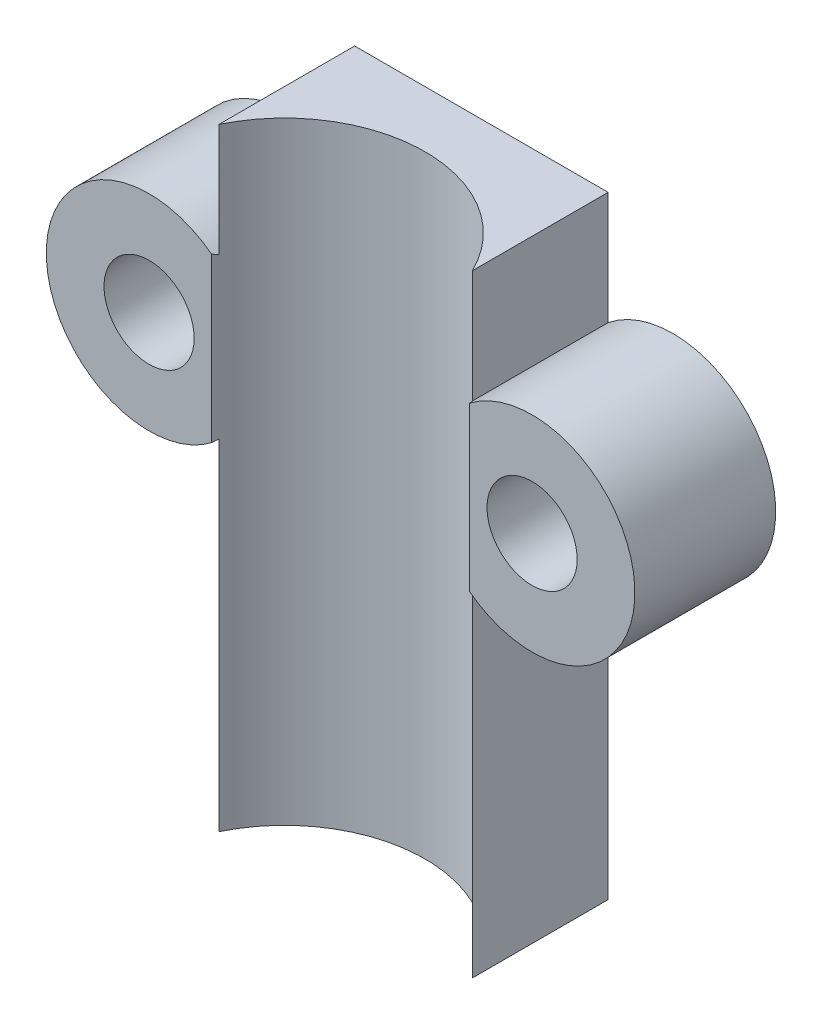
ISO-10303-21;
HEADER;
FILE_DESCRIPTION(('STEP AP214'),'2;1');
FILE_NAME('part.step','',(''),(''),'','','');
FILE_SCHEMA(('AUTOMOTIVE_DESIGN { 1 0 10303 214 1 1 1 1 }'));
ENDSEC;
DATA;
#1=APPLICATION_CONTEXT('core data for automotive mechanical design processes');
#2=APPLICATION_PROTOCOL_DEFINITION('international standard','automotive_design',2000,#1);
#3=PRODUCT_CONTEXT('',#1,'mechanical');
#4=PRODUCT('Part','Part','',(#3));
#5=PRODUCT_RELATED_PRODUCT_CATEGORY('part','',(#4));
#6=PRODUCT_DEFINITION_FORMATION('','',#4);
#7=PRODUCT_DEFINITION_CONTEXT('part definition',#1,'design');
#8=PRODUCT_DEFINITION('design','',#6,#7);
#9=PRODUCT_DEFINITION_SHAPE('','',#8);
#10=(LENGTH_UNIT() NAMED_UNIT(*) SI_UNIT(.MILLI.,.METRE.));
#11=(NAMED_UNIT(*) PLANE_ANGLE_UNIT() SI_UNIT($,.RADIAN.));
#12=(NAMED_UNIT(*) SI_UNIT($,.STERADIAN.) SOLID_ANGLE_UNIT());
#13=UNCERTAINTY_MEASURE_WITH_UNIT(LENGTH_MEASURE(1.E-05),#10,'distance_accuracy_value','');
#14=(GEOMETRIC_REPRESENTATION_CONTEXT(3) GLOBAL_UNCERTAINTY_ASSIGNED_CONTEXT((#13)) GLOBAL_UNIT_ASSIGNED_CONTEXT((#10,
#11,#12)) REPRESENTATION_CONTEXT('',''));
#15=CARTESIAN_POINT('',(0.,0.,0.));
#16=DIRECTION('',(0.,0.,1.));
#17=DIRECTION('',(1.,0.,0.));
#18=AXIS2_PLACEMENT_3D('',#15,#16,#17);
#19=CARTESIAN_POINT('',(-156.498398621395,-8.56795261254389,5.));
#20=DIRECTION('',(0.,0.,1.));
#21=DIRECTION('',(1.,0.,0.));
#22=AXIS2_PLACEMENT_3D('',#19,#20,#21);
#23=PLANE('',#22);
#24=DIRECTION('',(0.,1.,0.));
#25=VECTOR('',#24,1.);
#26=CARTESIAN_POINT('',(-145.11582292644,-23.4779526125439,5.));
#27=LINE('',#26,#25);
#28=CARTESIAN_POINT('',(-145.11582292644,-11.4671817258427,5.));
#29=VERTEX_POINT('',#28);
#30=CARTESIAN_POINT('',(-145.11582292644,-5.66872349924507,5.));
#31=VERTEX_POINT('',#30);
#32=EDGE_CURVE('E234',#29,#31,#27,.T.);
#33=ORIENTED_EDGE('',*,*,#32,.F.);
#34=CARTESIAN_POINT('',(-142.898398621395,-8.56795261254389,5.));
#35=DIRECTION('',(0.,0.,1.));
#36=DIRECTION('',(-1.,0.,0.));
#37=AXIS2_PLACEMENT_3D('',#34,#35,#36);
#38=CIRCLE('',#37,3.65);
#39=EDGE_CURVE('E204',#29,#31,#38,.T.);
#40=ORIENTED_EDGE('',*,*,#39,.T.);
#41=EDGE_LOOP('',(#33,#40));
#42=FACE_BOUND('',#41,.T.);
#43=CARTESIAN_POINT('',(-142.898398621395,-8.56795261254389,5.));
#44=DIRECTION('',(0.,0.,1.));
#45=DIRECTION('',(1.,0.,0.));
#46=AXIS2_PLACEMENT_3D('',#43,#44,#45);
#47=CIRCLE('',#46,1.59999999999999);
#48=CARTESIAN_POINT('',(-141.298398621395,-8.56795261254389,5.));
#49=VERTEX_POINT('',#48);
#50=EDGE_CURVE('E278',#49,#49,#47,.T.);
#51=ORIENTED_EDGE('',*,*,#50,.F.);
#52=EDGE_LOOP('',(#51));
#53=FACE_BOUND('',#52,.T.);
#54=ADVANCED_FACE('F44',(#42,#53),#23,.T.);
#55=DIRECTION('',(0.,1.,0.));
#56=VECTOR('',#55,1.);
#57=CARTESIAN_POINT('',(-154.280974316351,-23.4779526125439,5.));
#58=LINE('',#57,#56);
#59=CARTESIAN_POINT('',(-154.280974316351,-5.66872349924508,5.));
#60=VERTEX_POINT('',#59);
#61=CARTESIAN_POINT('',(-154.280974316351,-11.4671817258427,5.));
#62=VERTEX_POINT('',#61);
#63=EDGE_CURVE('E261',#60,#62,#58,.F.);
#64=ORIENTED_EDGE('',*,*,#63,.F.);
#65=CARTESIAN_POINT('',(-156.498398621395,-8.56795261254389,5.));
#66=DIRECTION('',(0.,0.,1.));
#67=DIRECTION('',(1.,0.,0.));
#68=AXIS2_PLACEMENT_3D('',#65,#66,#67);
#69=CIRCLE('',#68,3.65);
#70=EDGE_CURVE('E200',#60,#62,#69,.T.);
#71=ORIENTED_EDGE('',*,*,#70,.T.);
#72=EDGE_LOOP('',(#64,#71));
#73=FACE_BOUND('',#72,.T.);
#74=CARTESIAN_POINT('',(-156.498398621395,-8.56795261254389,5.));
#75=DIRECTION('',(0.,0.,1.));
#76=DIRECTION('',(1.,0.,0.));
#77=AXIS2_PLACEMENT_3D('',#74,#75,#76);
#78=CIRCLE('',#77,1.59999999999999);
#79=CARTESIAN_POINT('',(-154.898398621395,-8.56795261254389,5.));
#80=VERTEX_POINT('',#79);
#81=EDGE_CURVE('E286',#80,#80,#78,.T.);
#82=ORIENTED_EDGE('',*,*,#81,.F.);
#83=EDGE_LOOP('',(#82));
#84=FACE_BOUND('',#83,.T.);
#85=ADVANCED_FACE('F301',(#73,#84),#23,.T.);
#86=CARTESIAN_POINT('',(-156.498398621395,-8.56795261254389,0.));
#87=DIRECTION('',(0.,0.,1.));
#88=DIRECTION('',(1.,0.,0.));
#89=AXIS2_PLACEMENT_3D('',#86,#87,#88);
#90=PLANE('',#89);
#91=DIRECTION('',(0.,-1.,0.));
#92=VECTOR('',#91,1.);
#93=CARTESIAN_POINT('',(-154.198398621395,-1.72795261254389,0.));
#94=LINE('',#93,#92);
#95=CARTESIAN_POINT('',(-154.198398621395,-1.72795261254389,0.));
#96=VERTEX_POINT('',#95);
#97=CARTESIAN_POINT('',(-154.198398621395,-5.73378606839021,0.));
#98=VERTEX_POINT('',#97);
#99=EDGE_CURVE('E176',#96,#98,#94,.T.);
#100=ORIENTED_EDGE('',*,*,#99,.F.);
#101=DIRECTION('',(-1.,0.,0.));
#102=VECTOR('',#101,1.);
#103=CARTESIAN_POINT('',(-154.198398621395,-1.72795261254389,0.));
#104=LINE('',#103,#102);
#105=CARTESIAN_POINT('',(-145.198398621395,-1.72795261254389,0.));
#106=VERTEX_POINT('',#105);
#107=EDGE_CURVE('E197',#106,#96,#104,.T.);
#108=ORIENTED_EDGE('',*,*,#107,.F.);
#109=DIRECTION('',(0.,1.,0.));
#110=VECTOR('',#109,1.);
#111=CARTESIAN_POINT('',(-145.198398621395,-1.72795261254389,0.));
#112=LINE('',#111,#110);
#113=CARTESIAN_POINT('',(-145.198398621395,-5.73378606839021,0.));
#114=VERTEX_POINT('',#113);
#115=EDGE_CURVE('E193',#114,#106,#112,.T.);
#116=ORIENTED_EDGE('',*,*,#115,.F.);
#117=CARTESIAN_POINT('',(-142.898398621395,-8.56795261254389,0.));
#118=DIRECTION('',(0.,0.,1.));
#119=DIRECTION('',(-1.,0.,0.));
#120=AXIS2_PLACEMENT_3D('',#117,#118,#119);
#121=CIRCLE('',#120,3.65);
#122=CARTESIAN_POINT('',(-145.198398621395,-11.4021191566976,0.));
#123=VERTEX_POINT('',#122);
#124=EDGE_CURVE('E189',#123,#114,#121,.T.);
#125=ORIENTED_EDGE('',*,*,#124,.F.);
#126=DIRECTION('',(0.,1.,0.));
#127=VECTOR('',#126,1.);
#128=CARTESIAN_POINT('',(-145.198398621395,-11.4021191566976,0.));
#129=LINE('',#128,#127);
#130=CARTESIAN_POINT('',(-145.198398621395,-23.4779526125439,0.));
#131=VERTEX_POINT('',#130);
#132=EDGE_CURVE('E183',#131,#123,#129,.T.);
#133=ORIENTED_EDGE('',*,*,#132,.F.);
#134=DIRECTION('',(1.,0.,0.));
#135=VECTOR('',#134,1.);
#136=CARTESIAN_POINT('',(-154.198398621395,-23.4779526125439,0.));
#137=LINE('',#136,#135);
#138=CARTESIAN_POINT('',(-154.198398621395,-23.4779526125439,0.));
#139=VERTEX_POINT('',#138);
#140=EDGE_CURVE('E146',#139,#131,#137,.T.);
#141=ORIENTED_EDGE('',*,*,#140,.F.);
#142=DIRECTION('',(0.,-1.,0.));
#143=VECTOR('',#142,1.);
#144=CARTESIAN_POINT('',(-154.198398621395,-11.4021191566976,0.));
#145=LINE('',#144,#143);
#146=CARTESIAN_POINT('',(-154.198398621395,-11.4021191566976,0.));
#147=VERTEX_POINT('',#146);
#148=EDGE_CURVE('E164',#147,#139,#145,.T.);
#149=ORIENTED_EDGE('',*,*,#148,.F.);
#150=CARTESIAN_POINT('',(-156.498398621395,-8.56795261254389,0.));
#151=DIRECTION('',(0.,0.,1.));
#152=DIRECTION('',(1.,0.,0.));
#153=AXIS2_PLACEMENT_3D('',#150,#151,#152);
#154=CIRCLE('',#153,3.65);
#155=EDGE_CURVE('E168',#98,#147,#154,.T.);
#156=ORIENTED_EDGE('',*,*,#155,.F.);
#157=EDGE_LOOP('',(#100,#108,#116,#125,#133,#141,#149,#156));
#158=FACE_BOUND('',#157,.T.);
#159=CARTESIAN_POINT('',(-156.498398621395,-8.56795261254389,0.));
#160=DIRECTION('',(0.,0.,1.));
#161=DIRECTION('',(1.,0.,0.));
#162=AXIS2_PLACEMENT_3D('',#159,#160,#161);
#163=CIRCLE('',#162,1.59999999999999);
#164=CARTESIAN_POINT('',(-154.898398621395,-8.56795261254389,0.));
#165=VERTEX_POINT('',#164);
#166=EDGE_CURVE('E282',#165,#165,#163,.T.);
#167=ORIENTED_EDGE('',*,*,#166,.T.);
#168=EDGE_LOOP('',(#167));
#169=FACE_BOUND('',#168,.T.);
#170=CARTESIAN_POINT('',(-142.898398621395,-8.56795261254389,0.));
#171=DIRECTION('',(0.,0.,1.));
#172=DIRECTION('',(1.,0.,0.));
#173=AXIS2_PLACEMENT_3D('',#170,#171,#172);
#174=CIRCLE('',#173,1.59999999999999);
#175=CARTESIAN_POINT('',(-141.298398621395,-8.56795261254389,0.));
#176=VERTEX_POINT('',#175);
#177=EDGE_CURVE('E277',#176,#176,#174,.T.);
#178=ORIENTED_EDGE('',*,*,#177,.T.);
#179=EDGE_LOOP('',(#178));
#180=FACE_BOUND('',#179,.T.);
#181=ADVANCED_FACE('F178',(#158,#169,#180),#90,.F.);
#182=CARTESIAN_POINT('',(-154.198398621395,-1.72795261254389,5.));
#183=DIRECTION('',(1.,0.,0.));
#184=DIRECTION('',(0.,0.,-1.));
#185=AXIS2_PLACEMENT_3D('',#182,#183,#184);
#186=PLANE('',#185);
#187=DIRECTION('',(0.,0.,-1.));
#188=VECTOR('',#187,1.);
#189=CARTESIAN_POINT('',(-154.198398621395,-5.73378606839021,5.));
#190=LINE('',#189,#188);
#191=CARTESIAN_POINT('',(-154.198398621395,-5.73378606839021,4.82055052822963));
#192=VERTEX_POINT('',#191);
#193=EDGE_CURVE('E12',#192,#98,#190,.T.);
#194=ORIENTED_EDGE('',*,*,#193,.F.);
#195=DIRECTION('',(0.,1.,0.));
#196=VECTOR('',#195,1.);
#197=CARTESIAN_POINT('',(-154.198398621395,-23.4779526125439,4.82055052822963));
#198=LINE('',#197,#196);
#199=CARTESIAN_POINT('',(-154.198398621395,-1.72795261254389,4.82055052822963));
#200=VERTEX_POINT('',#199);
#201=EDGE_CURVE('E274',#192,#200,#198,.T.);
#202=ORIENTED_EDGE('',*,*,#201,.T.);
#203=DIRECTION('',(0.,0.,-1.));
#204=VECTOR('',#203,1.);
#205=CARTESIAN_POINT('',(-154.198398621395,-1.72795261254389,5.));
#206=LINE('',#205,#204);
#207=EDGE_CURVE('E68',#200,#96,#206,.T.);
#208=ORIENTED_EDGE('',*,*,#207,.T.);
#209=ORIENTED_EDGE('',*,*,#99,.T.);
#210=EDGE_LOOP('',(#194,#202,#208,#209));
#211=FACE_BOUND('',#210,.T.);
#212=ADVANCED_FACE('F46',(#211),#186,.F.);
#213=CARTESIAN_POINT('',(-156.498398621395,-8.56795261254389,5.));
#214=DIRECTION('',(0.,0.,-1.));
#215=DIRECTION('',(-1.,0.,0.));
#216=AXIS2_PLACEMENT_3D('',#213,#214,#215);
#217=CYLINDRICAL_SURFACE('',#216,3.65);
#218=ORIENTED_EDGE('',*,*,#70,.F.);
#219=CARTESIAN_POINT('',(-154.280974316351,-5.66872349924508,5.));
#220=CARTESIAN_POINT('',(-154.267704843583,-5.67885762950029,4.96960754003286));
#221=CARTESIAN_POINT('',(-154.254188799283,-5.68934657539224,4.93945718739581));
#222=CARTESIAN_POINT('',(-154.226663567631,-5.71103409844088,4.87964069680597));
#223=CARTESIAN_POINT('',(-154.212654380279,-5.722232675597,4.84997455885279));
#224=CARTESIAN_POINT('',(-154.198398621395,-5.73378606838929,4.82055052822931));
#225=B_SPLINE_CURVE_WITH_KNOTS('',3,(#219,#220,#221,#222,#223,#224),.UNSPECIFIED.,.F.,.F.,(4,2,
4),(0.,0.103998590529928,0.20799718097612),.UNSPECIFIED.);
#226=EDGE_CURVE('E267',#60,#192,#225,.T.);
#227=ORIENTED_EDGE('',*,*,#226,.T.);
#228=ORIENTED_EDGE('',*,*,#193,.T.);
#229=ORIENTED_EDGE('',*,*,#155,.T.);
#230=DIRECTION('',(0.,0.,-1.));
#231=VECTOR('',#230,1.);
#232=CARTESIAN_POINT('',(-154.198398621395,-11.4021191566976,5.));
#233=LINE('',#232,#231);
#234=CARTESIAN_POINT('',(-154.198398621395,-11.4021191566976,4.82055052822963));
#235=VERTEX_POINT('',#234);
#236=EDGE_CURVE('E53',#235,#147,#233,.T.);
#237=ORIENTED_EDGE('',*,*,#236,.F.);
#238=CARTESIAN_POINT('',(-154.198398621395,-11.4021191566976,4.82055052822963));
#239=CARTESIAN_POINT('',(-154.212654380279,-11.4136725494902,4.84997455885299));
#240=CARTESIAN_POINT('',(-154.226663567631,-11.4248711266466,4.87964069680606));
#241=CARTESIAN_POINT('',(-154.254188799283,-11.4465586496958,4.93945718739567));
#242=CARTESIAN_POINT('',(-154.267704843583,-11.457047595588,4.96960754003261));
#243=CARTESIAN_POINT('',(-154.280974316351,-11.4671817258435,4.99999999999965));
#244=B_SPLINE_CURVE_WITH_KNOTS('',3,(#238,#239,#240,#241,#242,#243),.UNSPECIFIED.,.F.,.F.,(4,2,
4),(0.,0.103998590446202,0.207997180976114),.UNSPECIFIED.);
#245=EDGE_CURVE('E253',#235,#62,#244,.T.);
#246=ORIENTED_EDGE('',*,*,#245,.T.);
#247=EDGE_LOOP('',(#218,#227,#228,#229,#237,#246));
#248=FACE_BOUND('',#247,.T.);
#249=ADVANCED_FACE('F170',(#248),#217,.T.);
#250=CARTESIAN_POINT('',(-154.198398621395,-11.4021191566976,5.));
#251=DIRECTION('',(1.,0.,0.));
#252=DIRECTION('',(0.,0.,-1.));
#253=AXIS2_PLACEMENT_3D('',#250,#251,#252);
#254=PLANE('',#253);
#255=DIRECTION('',(0.,0.,-1.));
#256=VECTOR('',#255,1.);
#257=CARTESIAN_POINT('',(-154.198398621395,-23.4779526125439,5.));
#258=LINE('',#257,#256);
#259=CARTESIAN_POINT('',(-154.198398621395,-23.4779526125439,4.82055052822963));
#260=VERTEX_POINT('',#259);
#261=EDGE_CURVE('E149',#260,#139,#258,.T.);
#262=ORIENTED_EDGE('',*,*,#261,.F.);
#263=DIRECTION('',(0.,1.,0.));
#264=VECTOR('',#263,1.);
#265=CARTESIAN_POINT('',(-154.198398621395,-23.4779526125439,4.82055052822963));
#266=LINE('',#265,#264);
#267=EDGE_CURVE('E127',#260,#235,#266,.T.);
#268=ORIENTED_EDGE('',*,*,#267,.T.);
#269=ORIENTED_EDGE('',*,*,#236,.T.);
#270=ORIENTED_EDGE('',*,*,#148,.T.);
#271=EDGE_LOOP('',(#262,#268,#269,#270));
#272=FACE_BOUND('',#271,.T.);
#273=ADVANCED_FACE('F162',(#272),#254,.F.);
#274=CARTESIAN_POINT('',(-154.198398621395,-23.4779526125439,5.));
#275=DIRECTION('',(0.,1.,0.));
#276=DIRECTION('',(0.,0.,1.));
#277=AXIS2_PLACEMENT_3D('',#274,#275,#276);
#278=PLANE('',#277);
#279=DIRECTION('',(0.,0.,-1.));
#280=VECTOR('',#279,1.);
#281=CARTESIAN_POINT('',(-145.198398621395,-23.4779526125439,5.));
#282=LINE('',#281,#280);
#283=CARTESIAN_POINT('',(-145.198398621395,-23.4779526125439,4.82055052822963));
#284=VERTEX_POINT('',#283);
#285=EDGE_CURVE('E138',#284,#131,#282,.T.);
#286=ORIENTED_EDGE('',*,*,#285,.F.);
#287=CARTESIAN_POINT('',(-149.698398621395,-23.4779526125439,7.));
#288=DIRECTION('',(0.,1.,0.));
#289=DIRECTION('',(0.,0.,1.));
#290=AXIS2_PLACEMENT_3D('',#287,#288,#289);
#291=CIRCLE('',#290,5.00000000000002);
#292=EDGE_CURVE('E121',#284,#260,#291,.T.);
#293=ORIENTED_EDGE('',*,*,#292,.T.);
#294=ORIENTED_EDGE('',*,*,#261,.T.);
#295=ORIENTED_EDGE('',*,*,#140,.T.);
#296=EDGE_LOOP('',(#286,#293,#294,#295));
#297=FACE_BOUND('',#296,.T.);
#298=ADVANCED_FACE('F144',(#297),#278,.F.);
#299=CARTESIAN_POINT('',(-145.198398621395,-11.4021191566976,5.));
#300=DIRECTION('',(-1.,0.,0.));
#301=DIRECTION('',(0.,0.,1.));
#302=AXIS2_PLACEMENT_3D('',#299,#300,#301);
#303=PLANE('',#302);
#304=DIRECTION('',(0.,0.,-1.));
#305=VECTOR('',#304,1.);
#306=CARTESIAN_POINT('',(-145.198398621395,-11.4021191566976,5.));
#307=LINE('',#306,#305);
#308=CARTESIAN_POINT('',(-145.198398621395,-11.4021191566976,4.82055052822963));
#309=VERTEX_POINT('',#308);
#310=EDGE_CURVE('E140',#309,#123,#307,.T.);
#311=ORIENTED_EDGE('',*,*,#310,.F.);
#312=DIRECTION('',(0.,1.,0.));
#313=VECTOR('',#312,1.);
#314=CARTESIAN_POINT('',(-145.198398621395,-23.4779526125439,4.82055052822963));
#315=LINE('',#314,#313);
#316=EDGE_CURVE('E124',#309,#284,#315,.F.);
#317=ORIENTED_EDGE('',*,*,#316,.T.);
#318=ORIENTED_EDGE('',*,*,#285,.T.);
#319=ORIENTED_EDGE('',*,*,#132,.T.);
#320=EDGE_LOOP('',(#311,#317,#318,#319));
#321=FACE_BOUND('',#320,.T.);
#322=ADVANCED_FACE('F136',(#321),#303,.F.);
#323=CARTESIAN_POINT('',(-142.898398621395,-8.56795261254389,5.));
#324=DIRECTION('',(0.,0.,-1.));
#325=DIRECTION('',(-1.,0.,0.));
#326=AXIS2_PLACEMENT_3D('',#323,#324,#325);
#327=CYLINDRICAL_SURFACE('',#326,3.65);
#328=ORIENTED_EDGE('',*,*,#39,.F.);
#329=CARTESIAN_POINT('',(-145.11582292644,-11.4671817258427,5.));
#330=CARTESIAN_POINT('',(-145.129092399208,-11.4570475955875,4.96960754003286));
#331=CARTESIAN_POINT('',(-145.142608443507,-11.4465586496955,4.93945718739581));
#332=CARTESIAN_POINT('',(-145.17013367516,-11.4248711266469,4.87964069680597));
#333=CARTESIAN_POINT('',(-145.184142862512,-11.4136725494908,4.84997455885279));
#334=CARTESIAN_POINT('',(-145.198398621395,-11.4021191566985,4.82055052822931));
#335=B_SPLINE_CURVE_WITH_KNOTS('',3,(#329,#330,#331,#332,#333,#334),.UNSPECIFIED.,.F.,.F.,(4,2,
4),(0.,0.103998590529929,0.20799718097612),.UNSPECIFIED.);
#336=EDGE_CURVE('E142',#29,#309,#335,.T.);
#337=ORIENTED_EDGE('',*,*,#336,.T.);
#338=ORIENTED_EDGE('',*,*,#310,.T.);
#339=ORIENTED_EDGE('',*,*,#124,.T.);
#340=DIRECTION('',(0.,0.,-1.));
#341=VECTOR('',#340,1.);
#342=CARTESIAN_POINT('',(-145.198398621395,-5.73378606839021,5.));
#343=LINE('',#342,#341);
#344=CARTESIAN_POINT('',(-145.198398621395,-5.73378606839021,4.82055052822963));
#345=VERTEX_POINT('',#344);
#346=EDGE_CURVE('E154',#345,#114,#343,.T.);
#347=ORIENTED_EDGE('',*,*,#346,.F.);
#348=CARTESIAN_POINT('',(-145.198398621395,-5.73378606839021,4.82055052822963));
#349=CARTESIAN_POINT('',(-145.184142862512,-5.72223267559761,4.84997455885299));
#350=CARTESIAN_POINT('',(-145.17013367516,-5.71103409844118,4.87964069680606));
#351=CARTESIAN_POINT('',(-145.142608443507,-5.68934657539196,4.93945718739567));
#352=CARTESIAN_POINT('',(-145.129092399208,-5.67885762949974,4.96960754003261));
#353=CARTESIAN_POINT('',(-145.115822926439,-5.66872349924427,4.99999999999965));
#354=B_SPLINE_CURVE_WITH_KNOTS('',3,(#348,#349,#350,#351,#352,#353),.UNSPECIFIED.,.F.,.F.,(4,2,
4),(0.,0.103998590446202,0.207997180976113),.UNSPECIFIED.);
#355=EDGE_CURVE('E225',#345,#31,#354,.T.);
#356=ORIENTED_EDGE('',*,*,#355,.T.);
#357=EDGE_LOOP('',(#328,#337,#338,#339,#347,#356));
#358=FACE_BOUND('',#357,.T.);
#359=ADVANCED_FACE('F217',(#358),#327,.T.);
#360=CARTESIAN_POINT('',(-145.198398621395,-1.72795261254389,5.));
#361=DIRECTION('',(-1.,0.,0.));
#362=DIRECTION('',(0.,0.,1.));
#363=AXIS2_PLACEMENT_3D('',#360,#361,#362);
#364=PLANE('',#363);
#365=DIRECTION('',(0.,0.,-1.));
#366=VECTOR('',#365,1.);
#367=CARTESIAN_POINT('',(-145.198398621395,-1.72795261254389,5.));
#368=LINE('',#367,#366);
#369=CARTESIAN_POINT('',(-145.198398621395,-1.7279526125439,4.82055052822963));
#370=VERTEX_POINT('',#369);
#371=EDGE_CURVE('E203',#370,#106,#368,.T.);
#372=ORIENTED_EDGE('',*,*,#371,.F.);
#373=DIRECTION('',(0.,1.,0.));
#374=VECTOR('',#373,1.);
#375=CARTESIAN_POINT('',(-145.198398621395,-23.4779526125439,4.82055052822963));
#376=LINE('',#375,#374);
#377=EDGE_CURVE('E60',#370,#345,#376,.F.);
#378=ORIENTED_EDGE('',*,*,#377,.T.);
#379=ORIENTED_EDGE('',*,*,#346,.T.);
#380=ORIENTED_EDGE('',*,*,#115,.T.);
#381=EDGE_LOOP('',(#372,#378,#379,#380));
#382=FACE_BOUND('',#381,.T.);
#383=ADVANCED_FACE('F210',(#382),#364,.F.);
#384=CARTESIAN_POINT('',(-154.198398621395,-1.72795261254389,5.));
#385=DIRECTION('',(0.,-1.,0.));
#386=DIRECTION('',(0.,0.,-1.));
#387=AXIS2_PLACEMENT_3D('',#384,#385,#386);
#388=PLANE('',#387);
#389=ORIENTED_EDGE('',*,*,#207,.F.);
#390=CARTESIAN_POINT('',(-149.698398621395,-1.72795261254389,7.));
#391=DIRECTION('',(0.,1.,0.));
#392=DIRECTION('',(0.,0.,1.));
#393=AXIS2_PLACEMENT_3D('',#390,#391,#392);
#394=CIRCLE('',#393,5.00000000000002);
#395=EDGE_CURVE('E132',#370,#200,#394,.T.);
#396=ORIENTED_EDGE('',*,*,#395,.F.);
#397=ORIENTED_EDGE('',*,*,#371,.T.);
#398=ORIENTED_EDGE('',*,*,#107,.T.);
#399=EDGE_LOOP('',(#389,#396,#397,#398));
#400=FACE_BOUND('',#399,.T.);
#401=ADVANCED_FACE('F219',(#400),#388,.F.);
#402=CARTESIAN_POINT('',(-156.498398621395,-8.56795261254389,5.));
#403=DIRECTION('',(0.,0.,-1.));
#404=DIRECTION('',(-1.,0.,0.));
#405=AXIS2_PLACEMENT_3D('',#402,#403,#404);
#406=CYLINDRICAL_SURFACE('',#405,1.59999999999999);
#407=ORIENTED_EDGE('',*,*,#81,.T.);
#408=EDGE_LOOP('',(#407));
#409=FACE_BOUND('',#408,.T.);
#410=ORIENTED_EDGE('',*,*,#166,.F.);
#411=EDGE_LOOP('',(#410));
#412=FACE_BOUND('',#411,.T.);
#413=ADVANCED_FACE('F316',(#409,#412),#406,.F.);
#414=CARTESIAN_POINT('',(-142.898398621395,-8.56795261254389,5.));
#415=DIRECTION('',(0.,0.,-1.));
#416=DIRECTION('',(-1.,0.,0.));
#417=AXIS2_PLACEMENT_3D('',#414,#415,#416);
#418=CYLINDRICAL_SURFACE('',#417,1.59999999999999);
#419=ORIENTED_EDGE('',*,*,#50,.T.);
#420=EDGE_LOOP('',(#419));
#421=FACE_BOUND('',#420,.T.);
#422=ORIENTED_EDGE('',*,*,#177,.F.);
#423=EDGE_LOOP('',(#422));
#424=FACE_BOUND('',#423,.T.);
#425=ADVANCED_FACE('F242',(#421,#424),#418,.F.);
#426=CARTESIAN_POINT('',(-149.698398621395,-23.4779526125439,7.));
#427=DIRECTION('',(0.,1.,0.));
#428=DIRECTION('',(0.,0.,1.));
#429=AXIS2_PLACEMENT_3D('',#426,#427,#428);
#430=CYLINDRICAL_SURFACE('',#429,5.00000000000002);
#431=ORIENTED_EDGE('',*,*,#226,.F.);
#432=ORIENTED_EDGE('',*,*,#63,.T.);
#433=ORIENTED_EDGE('',*,*,#245,.F.);
#434=ORIENTED_EDGE('',*,*,#267,.F.);
#435=ORIENTED_EDGE('',*,*,#292,.F.);
#436=ORIENTED_EDGE('',*,*,#316,.F.);
#437=ORIENTED_EDGE('',*,*,#336,.F.);
#438=ORIENTED_EDGE('',*,*,#32,.T.);
#439=ORIENTED_EDGE('',*,*,#355,.F.);
#440=ORIENTED_EDGE('',*,*,#377,.F.);
#441=ORIENTED_EDGE('',*,*,#395,.T.);
#442=ORIENTED_EDGE('',*,*,#201,.F.);
#443=EDGE_LOOP('',(#431,#432,#433,#434,#435,#436,#437,#438,#439,#440,#441,#442));
#444=FACE_BOUND('',#443,.T.);
#445=ADVANCED_FACE('F123',(#444),#430,.F.);
#446=CLOSED_SHELL('',(#54,#85,#181,#212,#249,#273,#298,#322,#359,#383,#401,#413,#425,#445));
#447=MANIFOLD_SOLID_BREP('B2',#446);
#448=ADVANCED_BREP_SHAPE_REPRESENTATION('',(#18,#447),#14);
#449=SHAPE_DEFINITION_REPRESENTATION(#9,#448);
ENDSEC;
END-ISO-10303-21;
